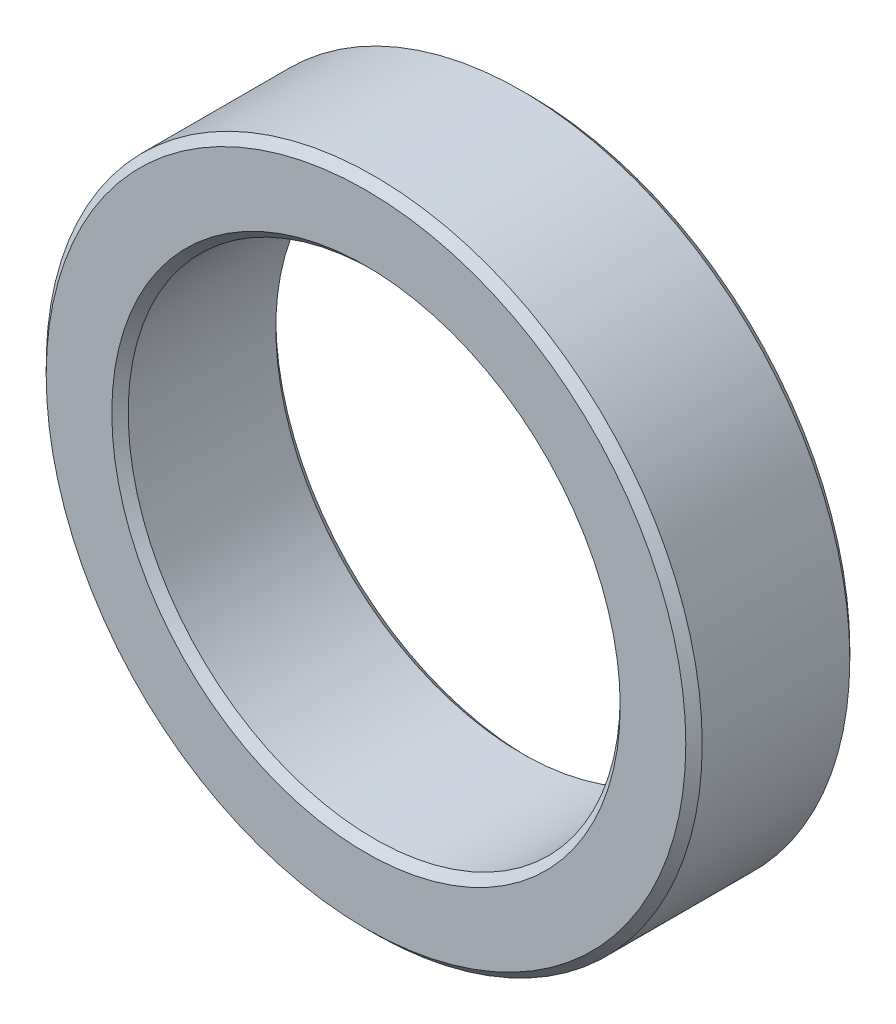
ISO-10303-21;
HEADER;
FILE_DESCRIPTION(('STEP AP214'),'2;1');
FILE_NAME('part.step','',(''),(''),'','','');
FILE_SCHEMA(('AUTOMOTIVE_DESIGN { 1 0 10303 214 1 1 1 1 }'));
ENDSEC;
DATA;
#1=APPLICATION_CONTEXT('core data for automotive mechanical design processes');
#2=APPLICATION_PROTOCOL_DEFINITION('international standard','automotive_design',2000,#1);
#3=PRODUCT_CONTEXT('',#1,'mechanical');
#4=PRODUCT('Part','Part','',(#3));
#5=PRODUCT_RELATED_PRODUCT_CATEGORY('part','',(#4));
#6=PRODUCT_DEFINITION_FORMATION('','',#4);
#7=PRODUCT_DEFINITION_CONTEXT('part definition',#1,'design');
#8=PRODUCT_DEFINITION('design','',#6,#7);
#9=PRODUCT_DEFINITION_SHAPE('','',#8);
#10=(LENGTH_UNIT() NAMED_UNIT(*) SI_UNIT(.MILLI.,.METRE.));
#11=(NAMED_UNIT(*) PLANE_ANGLE_UNIT() SI_UNIT($,.RADIAN.));
#12=(NAMED_UNIT(*) SI_UNIT($,.STERADIAN.) SOLID_ANGLE_UNIT());
#13=UNCERTAINTY_MEASURE_WITH_UNIT(LENGTH_MEASURE(1.E-05),#10,'distance_accuracy_value','');
#14=(GEOMETRIC_REPRESENTATION_CONTEXT(3) GLOBAL_UNCERTAINTY_ASSIGNED_CONTEXT((#13)) GLOBAL_UNIT_ASSIGNED_CONTEXT((#10,
#11,#12)) REPRESENTATION_CONTEXT('',''));
#15=CARTESIAN_POINT('',(0.,0.,0.));
#16=DIRECTION('',(0.,0.,1.));
#17=DIRECTION('',(1.,0.,0.));
#18=AXIS2_PLACEMENT_3D('',#15,#16,#17);
#19=CARTESIAN_POINT('',(0.,0.,4.));
#20=DIRECTION('',(0.,0.,1.));
#21=DIRECTION('',(1.,0.,0.));
#22=AXIS2_PLACEMENT_3D('',#19,#20,#21);
#23=PLANE('',#22);
#24=CARTESIAN_POINT('',(0.,0.,4.));
#25=DIRECTION('',(0.,0.,1.));
#26=DIRECTION('',(1.,0.,0.));
#27=AXIS2_PLACEMENT_3D('',#24,#25,#26);
#28=CIRCLE('',#27,7.8);
#29=CARTESIAN_POINT('',(7.8,0.,4.));
#30=VERTEX_POINT('',#29);
#31=EDGE_CURVE('E41',#30,#30,#28,.T.);
#32=ORIENTED_EDGE('',*,*,#31,.T.);
#33=EDGE_LOOP('',(#32));
#34=FACE_BOUND('',#33,.T.);
#35=CARTESIAN_POINT('',(0.,0.,4.));
#36=DIRECTION('',(0.,0.,1.));
#37=DIRECTION('',(1.,0.,0.));
#38=AXIS2_PLACEMENT_3D('',#35,#36,#37);
#39=CIRCLE('',#38,6.2);
#40=CARTESIAN_POINT('',(6.2,0.,4.));
#41=VERTEX_POINT('',#40);
#42=EDGE_CURVE('E45',#41,#41,#39,.F.);
#43=ORIENTED_EDGE('',*,*,#42,.T.);
#44=EDGE_LOOP('',(#43));
#45=FACE_BOUND('',#44,.T.);
#46=ADVANCED_FACE('F30',(#34,#45),#23,.T.);
#47=CARTESIAN_POINT('',(0.,0.,0.));
#48=DIRECTION('',(0.,0.,1.));
#49=DIRECTION('',(1.,0.,0.));
#50=AXIS2_PLACEMENT_3D('',#47,#48,#49);
#51=PLANE('',#50);
#52=CARTESIAN_POINT('',(0.,0.,0.));
#53=DIRECTION('',(0.,0.,1.));
#54=DIRECTION('',(1.,0.,0.));
#55=AXIS2_PLACEMENT_3D('',#52,#53,#54);
#56=CIRCLE('',#55,7.8);
#57=CARTESIAN_POINT('',(7.8,0.,0.));
#58=VERTEX_POINT('',#57);
#59=EDGE_CURVE('E50',#58,#58,#56,.F.);
#60=ORIENTED_EDGE('',*,*,#59,.T.);
#61=EDGE_LOOP('',(#60));
#62=FACE_BOUND('',#61,.T.);
#63=CARTESIAN_POINT('',(0.,0.,0.));
#64=DIRECTION('',(0.,0.,1.));
#65=DIRECTION('',(1.,0.,0.));
#66=AXIS2_PLACEMENT_3D('',#63,#64,#65);
#67=CIRCLE('',#66,6.2);
#68=CARTESIAN_POINT('',(6.2,0.,0.));
#69=VERTEX_POINT('',#68);
#70=EDGE_CURVE('E53',#69,#69,#67,.T.);
#71=ORIENTED_EDGE('',*,*,#70,.T.);
#72=EDGE_LOOP('',(#71));
#73=FACE_BOUND('',#72,.T.);
#74=ADVANCED_FACE('F75',(#62,#73),#51,.F.);
#75=CARTESIAN_POINT('',(0.,0.,4.));
#76=DIRECTION('',(0.,0.,-1.));
#77=DIRECTION('',(-1.,0.,0.));
#78=AXIS2_PLACEMENT_3D('',#75,#76,#77);
#79=CYLINDRICAL_SURFACE('',#78,8.);
#80=CARTESIAN_POINT('',(0.,0.,0.199999999999997));
#81=DIRECTION('',(0.,0.,1.));
#82=DIRECTION('',(1.,0.,0.));
#83=AXIS2_PLACEMENT_3D('',#80,#81,#82);
#84=CIRCLE('',#83,8.);
#85=CARTESIAN_POINT('',(8.,0.,0.199999999999997));
#86=VERTEX_POINT('',#85);
#87=EDGE_CURVE('E56',#86,#86,#84,.T.);
#88=ORIENTED_EDGE('',*,*,#87,.T.);
#89=EDGE_LOOP('',(#88));
#90=FACE_BOUND('',#89,.T.);
#91=CARTESIAN_POINT('',(0.,0.,3.8));
#92=DIRECTION('',(0.,0.,1.));
#93=DIRECTION('',(1.,0.,0.));
#94=AXIS2_PLACEMENT_3D('',#91,#92,#93);
#95=CIRCLE('',#94,8.);
#96=CARTESIAN_POINT('',(8.,0.,3.8));
#97=VERTEX_POINT('',#96);
#98=EDGE_CURVE('E59',#97,#97,#95,.F.);
#99=ORIENTED_EDGE('',*,*,#98,.T.);
#100=EDGE_LOOP('',(#99));
#101=FACE_BOUND('',#100,.T.);
#102=ADVANCED_FACE('F63',(#90,#101),#79,.T.);
#103=CARTESIAN_POINT('',(0.,0.,4.));
#104=DIRECTION('',(0.,0.,-1.));
#105=DIRECTION('',(-1.,0.,0.));
#106=AXIS2_PLACEMENT_3D('',#103,#104,#105);
#107=CYLINDRICAL_SURFACE('',#106,6.);
#108=CARTESIAN_POINT('',(0.,0.,0.200000000000002));
#109=DIRECTION('',(0.,0.,1.));
#110=DIRECTION('',(1.,0.,0.));
#111=AXIS2_PLACEMENT_3D('',#108,#109,#110);
#112=CIRCLE('',#111,6.);
#113=CARTESIAN_POINT('',(6.,0.,0.200000000000002));
#114=VERTEX_POINT('',#113);
#115=EDGE_CURVE('E10',#114,#114,#112,.F.);
#116=ORIENTED_EDGE('',*,*,#115,.T.);
#117=EDGE_LOOP('',(#116));
#118=FACE_BOUND('',#117,.T.);
#119=CARTESIAN_POINT('',(0.,0.,3.8));
#120=DIRECTION('',(0.,0.,1.));
#121=DIRECTION('',(1.,0.,0.));
#122=AXIS2_PLACEMENT_3D('',#119,#120,#121);
#123=CIRCLE('',#122,6.);
#124=CARTESIAN_POINT('',(6.,0.,3.8));
#125=VERTEX_POINT('',#124);
#126=EDGE_CURVE('E37',#125,#125,#123,.T.);
#127=ORIENTED_EDGE('',*,*,#126,.T.);
#128=EDGE_LOOP('',(#127));
#129=FACE_BOUND('',#128,.T.);
#130=ADVANCED_FACE('F91',(#118,#129),#107,.F.);
#131=CARTESIAN_POINT('',(0.,0.,0.199999999999997));
#132=DIRECTION('',(0.,0.,1.));
#133=DIRECTION('',(1.,0.,0.));
#134=AXIS2_PLACEMENT_3D('',#131,#132,#133);
#135=CONICAL_SURFACE('',#134,8.,0.785398163397453);
#136=ORIENTED_EDGE('',*,*,#59,.F.);
#137=EDGE_LOOP('',(#136));
#138=FACE_BOUND('',#137,.T.);
#139=ORIENTED_EDGE('',*,*,#87,.F.);
#140=EDGE_LOOP('',(#139));
#141=FACE_BOUND('',#140,.T.);
#142=ADVANCED_FACE('F69',(#138,#141),#135,.T.);
#143=CARTESIAN_POINT('',(0.,0.,4.));
#144=DIRECTION('',(0.,0.,-1.));
#145=DIRECTION('',(-1.,0.,0.));
#146=AXIS2_PLACEMENT_3D('',#143,#144,#145);
#147=CONICAL_SURFACE('',#146,7.8,0.785398163397448);
#148=ORIENTED_EDGE('',*,*,#98,.F.);
#149=EDGE_LOOP('',(#148));
#150=FACE_BOUND('',#149,.T.);
#151=ORIENTED_EDGE('',*,*,#31,.F.);
#152=EDGE_LOOP('',(#151));
#153=FACE_BOUND('',#152,.T.);
#154=ADVANCED_FACE('F65',(#150,#153),#147,.T.);
#155=CARTESIAN_POINT('',(0.,0.,0.));
#156=DIRECTION('',(0.,0.,-1.));
#157=DIRECTION('',(-1.,0.,0.));
#158=AXIS2_PLACEMENT_3D('',#155,#156,#157);
#159=CONICAL_SURFACE('',#158,6.2,0.785398163397446);
#160=ORIENTED_EDGE('',*,*,#115,.F.);
#161=EDGE_LOOP('',(#160));
#162=FACE_BOUND('',#161,.T.);
#163=ORIENTED_EDGE('',*,*,#70,.F.);
#164=EDGE_LOOP('',(#163));
#165=FACE_BOUND('',#164,.T.);
#166=ADVANCED_FACE('F68',(#162,#165),#159,.F.);
#167=CARTESIAN_POINT('',(0.,0.,3.8));
#168=DIRECTION('',(0.,0.,1.));
#169=DIRECTION('',(1.,0.,0.));
#170=AXIS2_PLACEMENT_3D('',#167,#168,#169);
#171=CONICAL_SURFACE('',#170,6.,0.785398163397446);
#172=ORIENTED_EDGE('',*,*,#42,.F.);
#173=EDGE_LOOP('',(#172));
#174=FACE_BOUND('',#173,.T.);
#175=ORIENTED_EDGE('',*,*,#126,.F.);
#176=EDGE_LOOP('',(#175));
#177=FACE_BOUND('',#176,.T.);
#178=ADVANCED_FACE('F32',(#174,#177),#171,.F.);
#179=CLOSED_SHELL('',(#46,#74,#102,#130,#142,#154,#166,#178));
#180=MANIFOLD_SOLID_BREP('B2',#179);
#181=ADVANCED_BREP_SHAPE_REPRESENTATION('',(#18,#180),#14);
#182=SHAPE_DEFINITION_REPRESENTATION(#9,#181);
ENDSEC;
END-ISO-10303-21;
